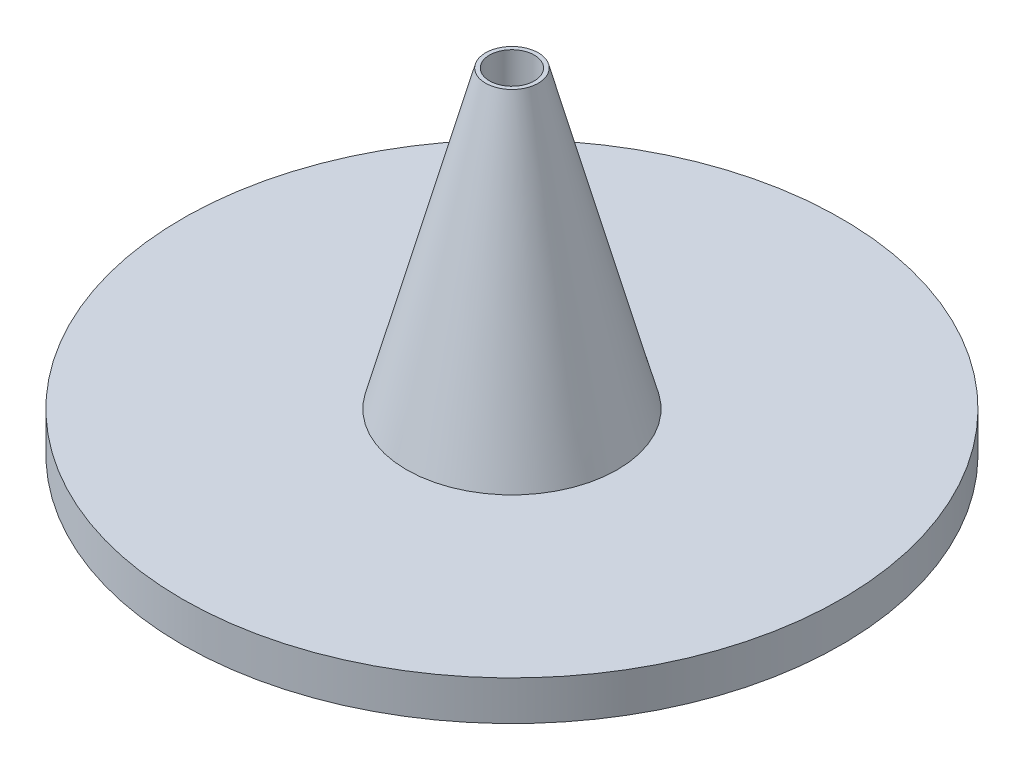
ISO-10303-21;
HEADER;
FILE_DESCRIPTION(('STEP AP214'),'2;1');
FILE_NAME('part.step','',(''),(''),'','','');
FILE_SCHEMA(('AUTOMOTIVE_DESIGN { 1 0 10303 214 1 1 1 1 }'));
ENDSEC;
DATA;
#1=APPLICATION_CONTEXT('core data for automotive mechanical design processes');
#2=APPLICATION_PROTOCOL_DEFINITION('international standard','automotive_design',2000,#1);
#3=PRODUCT_CONTEXT('',#1,'mechanical');
#4=PRODUCT('Part','Part','',(#3));
#5=PRODUCT_RELATED_PRODUCT_CATEGORY('part','',(#4));
#6=PRODUCT_DEFINITION_FORMATION('','',#4);
#7=PRODUCT_DEFINITION_CONTEXT('part definition',#1,'design');
#8=PRODUCT_DEFINITION('design','',#6,#7);
#9=PRODUCT_DEFINITION_SHAPE('','',#8);
#10=(LENGTH_UNIT() NAMED_UNIT(*) SI_UNIT(.MILLI.,.METRE.));
#11=(NAMED_UNIT(*) PLANE_ANGLE_UNIT() SI_UNIT($,.RADIAN.));
#12=(NAMED_UNIT(*) SI_UNIT($,.STERADIAN.) SOLID_ANGLE_UNIT());
#13=UNCERTAINTY_MEASURE_WITH_UNIT(LENGTH_MEASURE(1.E-05),#10,'distance_accuracy_value','');
#14=(GEOMETRIC_REPRESENTATION_CONTEXT(3) GLOBAL_UNCERTAINTY_ASSIGNED_CONTEXT((#13)) GLOBAL_UNIT_ASSIGNED_CONTEXT((#10,
#11,#12)) REPRESENTATION_CONTEXT('',''));
#15=CARTESIAN_POINT('',(0.,0.,0.));
#16=DIRECTION('',(0.,0.,1.));
#17=DIRECTION('',(1.,0.,0.));
#18=AXIS2_PLACEMENT_3D('',#15,#16,#17);
#19=CARTESIAN_POINT('',(0.,3.,0.));
#20=DIRECTION('',(0.,-1.,0.));
#21=DIRECTION('',(0.,0.,-1.));
#22=AXIS2_PLACEMENT_3D('',#19,#20,#21);
#23=CYLINDRICAL_SURFACE('',#22,25.);
#24=CARTESIAN_POINT('',(0.,3.,0.));
#25=DIRECTION('',(0.,1.,0.));
#26=DIRECTION('',(0.,0.,1.));
#27=AXIS2_PLACEMENT_3D('',#24,#25,#26);
#28=CIRCLE('',#27,25.);
#29=CARTESIAN_POINT('',(0.,3.,25.));
#30=VERTEX_POINT('',#29);
#31=EDGE_CURVE('E10',#30,#30,#28,.T.);
#32=ORIENTED_EDGE('',*,*,#31,.F.);
#33=EDGE_LOOP('',(#32));
#34=FACE_BOUND('',#33,.T.);
#35=CARTESIAN_POINT('',(0.,0.,0.));
#36=DIRECTION('',(0.,1.,0.));
#37=DIRECTION('',(0.,0.,1.));
#38=AXIS2_PLACEMENT_3D('',#35,#36,#37);
#39=CIRCLE('',#38,25.);
#40=CARTESIAN_POINT('',(0.,0.,25.));
#41=VERTEX_POINT('',#40);
#42=EDGE_CURVE('E40',#41,#41,#39,.T.);
#43=ORIENTED_EDGE('',*,*,#42,.T.);
#44=EDGE_LOOP('',(#43));
#45=FACE_BOUND('',#44,.T.);
#46=ADVANCED_FACE('F37',(#34,#45),#23,.T.);
#47=CARTESIAN_POINT('',(0.,3.,0.));
#48=DIRECTION('',(0.,1.,0.));
#49=DIRECTION('',(0.,0.,1.));
#50=AXIS2_PLACEMENT_3D('',#47,#48,#49);
#51=PLANE('',#50);
#52=CARTESIAN_POINT('',(0.,3.,0.));
#53=DIRECTION('',(0.,-1.,0.));
#54=DIRECTION('',(0.,0.,-1.));
#55=AXIS2_PLACEMENT_3D('',#52,#53,#54);
#56=CIRCLE('',#55,8.);
#57=CARTESIAN_POINT('',(0.,3.,-8.));
#58=VERTEX_POINT('',#57);
#59=EDGE_CURVE('E54',#58,#58,#56,.T.);
#60=ORIENTED_EDGE('',*,*,#59,.T.);
#61=EDGE_LOOP('',(#60));
#62=FACE_BOUND('',#61,.T.);
#63=ORIENTED_EDGE('',*,*,#31,.T.);
#64=EDGE_LOOP('',(#63));
#65=FACE_BOUND('',#64,.T.);
#66=ADVANCED_FACE('F90',(#62,#65),#51,.T.);
#67=CARTESIAN_POINT('',(0.,0.,0.));
#68=DIRECTION('',(0.,1.,0.));
#69=DIRECTION('',(0.,0.,1.));
#70=AXIS2_PLACEMENT_3D('',#67,#68,#69);
#71=PLANE('',#70);
#72=CARTESIAN_POINT('',(0.,0.,0.));
#73=DIRECTION('',(0.,1.,0.));
#74=DIRECTION('',(0.,0.,1.));
#75=AXIS2_PLACEMENT_3D('',#72,#73,#74);
#76=CIRCLE('',#75,1.7);
#77=CARTESIAN_POINT('',(0.,0.,1.7));
#78=VERTEX_POINT('',#77);
#79=EDGE_CURVE('E58',#78,#78,#76,.T.);
#80=ORIENTED_EDGE('',*,*,#79,.T.);
#81=EDGE_LOOP('',(#80));
#82=FACE_BOUND('',#81,.T.);
#83=ORIENTED_EDGE('',*,*,#42,.F.);
#84=EDGE_LOOP('',(#83));
#85=FACE_BOUND('',#84,.T.);
#86=ADVANCED_FACE('F67',(#82,#85),#71,.F.);
#87=CARTESIAN_POINT('',(0.,25.3923048454132,0.));
#88=DIRECTION('',(0.,-1.,0.));
#89=DIRECTION('',(0.,0.,-1.));
#90=AXIS2_PLACEMENT_3D('',#87,#88,#89);
#91=PLANE('',#90);
#92=CARTESIAN_POINT('',(0.,25.3923048454132,0.));
#93=DIRECTION('',(0.,1.,0.));
#94=DIRECTION('',(0.,0.,1.));
#95=AXIS2_PLACEMENT_3D('',#92,#93,#94);
#96=CIRCLE('',#95,1.7);
#97=CARTESIAN_POINT('',(0.,25.3923048454132,1.7));
#98=VERTEX_POINT('',#97);
#99=EDGE_CURVE('E59',#98,#98,#96,.T.);
#100=ORIENTED_EDGE('',*,*,#99,.F.);
#101=EDGE_LOOP('',(#100));
#102=FACE_BOUND('',#101,.T.);
#103=CARTESIAN_POINT('',(0.,25.3923048454132,0.));
#104=DIRECTION('',(0.,-1.,0.));
#105=DIRECTION('',(0.,0.,-1.));
#106=AXIS2_PLACEMENT_3D('',#103,#104,#105);
#107=CIRCLE('',#106,2.);
#108=CARTESIAN_POINT('',(0.,25.3923048454132,-2.));
#109=VERTEX_POINT('',#108);
#110=EDGE_CURVE('E49',#109,#109,#107,.T.);
#111=ORIENTED_EDGE('',*,*,#110,.F.);
#112=EDGE_LOOP('',(#111));
#113=FACE_BOUND('',#112,.T.);
#114=ADVANCED_FACE('F77',(#102,#113),#91,.F.);
#115=CARTESIAN_POINT('',(0.,25.3923048454132,0.));
#116=DIRECTION('',(0.,-1.,0.));
#117=DIRECTION('',(0.,0.,-1.));
#118=AXIS2_PLACEMENT_3D('',#115,#116,#117);
#119=CONICAL_SURFACE('',#118,2.,0.26179938779915);
#120=CARTESIAN_POINT('',(0.,3.,-8.));
#121=CARTESIAN_POINT('',(0.,3.23325317547305,-7.9375));
#122=CARTESIAN_POINT('',(0.,3.4665063509461,-7.875));
#123=CARTESIAN_POINT('',(0.,3.93301270189221,-7.75));
#124=CARTESIAN_POINT('',(0.,4.16626587736527,-7.6875));
#125=CARTESIAN_POINT('',(0.,4.63277222831138,-7.5625));
#126=CARTESIAN_POINT('',(0.,4.86602540378443,-7.5));
#127=CARTESIAN_POINT('',(0.,5.33253175473054,-7.375));
#128=CARTESIAN_POINT('',(0.,5.56578493020359,-7.3125));
#129=CARTESIAN_POINT('',(0.,6.0322912811497,-7.1875));
#130=CARTESIAN_POINT('',(0.,6.26554445662276,-7.125));
#131=CARTESIAN_POINT('',(0.,6.73205080756887,-7.));
#132=CARTESIAN_POINT('',(0.,6.96530398304192,-6.9375));
#133=CARTESIAN_POINT('',(0.,7.43181033398803,-6.8125));
#134=CARTESIAN_POINT('',(0.,7.66506350946108,-6.75));
#135=CARTESIAN_POINT('',(0.,8.13156986040719,-6.625));
#136=CARTESIAN_POINT('',(0.,8.36482303588025,-6.5625));
#137=CARTESIAN_POINT('',(0.,8.83132938682635,-6.4375));
#138=CARTESIAN_POINT('',(0.,9.06458256229941,-6.375));
#139=CARTESIAN_POINT('',(0.,9.53108891324552,-6.25));
#140=CARTESIAN_POINT('',(0.,9.76434208871857,-6.1875));
#141=CARTESIAN_POINT('',(0.,10.2308484396647,-6.0625));
#142=CARTESIAN_POINT('',(0.,10.4641016151377,-6.));
#143=CARTESIAN_POINT('',(0.,10.9306079660838,-5.875));
#144=CARTESIAN_POINT('',(0.,11.1638611415569,-5.8125));
#145=CARTESIAN_POINT('',(0.,11.630367492503,-5.6875));
#146=CARTESIAN_POINT('',(0.,11.8636206679761,-5.625));
#147=CARTESIAN_POINT('',(0.,12.3301270189222,-5.5));
#148=CARTESIAN_POINT('',(0.,12.5633801943952,-5.4375));
#149=CARTESIAN_POINT('',(0.,13.0298865453413,-5.3125));
#150=CARTESIAN_POINT('',(0.,13.2631397208144,-5.25));
#151=CARTESIAN_POINT('',(0.,13.7296460717605,-5.125));
#152=CARTESIAN_POINT('',(0.,13.9628992472336,-5.0625));
#153=CARTESIAN_POINT('',(0.,14.4294055981797,-4.9375));
#154=CARTESIAN_POINT('',(0.,14.6626587736527,-4.875));
#155=CARTESIAN_POINT('',(0.,15.1291651245988,-4.75));
#156=CARTESIAN_POINT('',(0.,15.3624183000719,-4.6875));
#157=CARTESIAN_POINT('',(0.,15.828924651018,-4.5625));
#158=CARTESIAN_POINT('',(0.,16.062177826491,-4.5));
#159=CARTESIAN_POINT('',(0.,16.5286841774371,-4.375));
#160=CARTESIAN_POINT('',(0.,16.7619373529102,-4.3125));
#161=CARTESIAN_POINT('',(0.,17.2284437038563,-4.1875));
#162=CARTESIAN_POINT('',(0.,17.4616968793294,-4.125));
#163=CARTESIAN_POINT('',(0.,17.9282032302755,-4.));
#164=CARTESIAN_POINT('',(0.,18.1614564057485,-3.9375));
#165=CARTESIAN_POINT('',(0.,18.6279627566946,-3.8125));
#166=CARTESIAN_POINT('',(0.,18.8612159321677,-3.75));
#167=CARTESIAN_POINT('',(0.,19.3277222831138,-3.625));
#168=CARTESIAN_POINT('',(0.,19.5609754585869,-3.5625));
#169=CARTESIAN_POINT('',(0.,20.027481809533,-3.4375));
#170=CARTESIAN_POINT('',(0.,20.260734985006,-3.375));
#171=CARTESIAN_POINT('',(0.,20.7272413359521,-3.25));
#172=CARTESIAN_POINT('',(0.,20.9604945114252,-3.1875));
#173=CARTESIAN_POINT('',(0.,21.4270008623713,-3.0625));
#174=CARTESIAN_POINT('',(0.,21.6602540378443,-3.));
#175=CARTESIAN_POINT('',(0.,22.1267603887905,-2.875));
#176=CARTESIAN_POINT('',(0.,22.3600135642635,-2.8125));
#177=CARTESIAN_POINT('',(0.,22.8265199152096,-2.6875));
#178=CARTESIAN_POINT('',(0.,23.0597730906827,-2.625));
#179=CARTESIAN_POINT('',(0.,23.5262794416288,-2.5));
#180=CARTESIAN_POINT('',(0.,23.7595326171018,-2.4375));
#181=CARTESIAN_POINT('',(0.,24.2260389680479,-2.3125));
#182=CARTESIAN_POINT('',(0.,24.459292143521,-2.25));
#183=CARTESIAN_POINT('',(0.,24.9257984944671,-2.125));
#184=CARTESIAN_POINT('',(0.,25.1590516699402,-2.0625));
#185=CARTESIAN_POINT('',(0.,25.3923048454132,-2.));
#186=B_SPLINE_CURVE_WITH_KNOTS('',3,(#120,#121,#122,#123,#124,#125,#126,#127,#128,#129,#130,
#131,#132,#133,#134,#135,#136,#137,#138,#139,#140,#141,#142,#143,#144,#145,#146,#147,#148,#149,
#150,#151,#152,#153,#154,#155,#156,#157,#158,#159,#160,#161,#162,#163,#164,#165,#166,#167,#168,
#169,#170,#171,#172,#173,#174,#175,#176,#177,#178,#179,#180,#181,#182,#183,#184,#185),
.UNSPECIFIED.,.F.,.F.,(4,2,2,2,2,2,2,2,2,2,2,2,2,2,2,2,2,2,2,2,2,2,2,2,2,2,2,2,2,2,2,2,4),(0.,
0.7244443697168,1.4488887394336,2.1733331091504,2.8977774788672,3.622221848584,4.3466662183008,
5.0711105880176,5.7955549577344,6.5199993274512,7.244443697168,7.9688880668848,8.6933324366016,
9.4177768063184,10.1422211760352,10.866665545752,11.5911099154688,12.3155542851856,
13.0399986549024,13.7644430246192,14.488887394336,15.2133317640528,15.9377761337696,
16.6622205034864,17.3866648732032,18.11110924292,18.8355536126368,19.5599979823536,
20.2844423520704,21.0088867217872,21.733331091504,22.4577754612208,23.1822198309376),.UNSPECIFIED.);
#187=EDGE_CURVE('BSEAM73',#58,#109,#186,.T.);
#188=ORIENTED_EDGE('',*,*,#59,.F.);
#189=ORIENTED_EDGE('',*,*,#110,.T.);
#190=ORIENTED_EDGE('',*,*,#187,.T.);
#191=ORIENTED_EDGE('',*,*,#187,.F.);
#192=EDGE_LOOP('',(#188,#190,#189,#191));
#193=FACE_BOUND('',#192,.T.);
#194=ADVANCED_FACE('F73',(#193),#119,.T.);
#195=CARTESIAN_POINT('',(0.,0.,0.));
#196=DIRECTION('',(0.,1.,0.));
#197=DIRECTION('',(0.,0.,1.));
#198=AXIS2_PLACEMENT_3D('',#195,#196,#197);
#199=CYLINDRICAL_SURFACE('',#198,1.7);
#200=CARTESIAN_POINT('',(0.,0.,1.7));
#201=CARTESIAN_POINT('',(0.,0.264503175473054,1.7));
#202=CARTESIAN_POINT('',(0.,0.529006350946108,1.7));
#203=CARTESIAN_POINT('',(0.,1.05801270189222,1.7));
#204=CARTESIAN_POINT('',(0.,1.32251587736527,1.7));
#205=CARTESIAN_POINT('',(0.,1.85152222831138,1.7));
#206=CARTESIAN_POINT('',(0.,2.11602540378443,1.7));
#207=CARTESIAN_POINT('',(0.,2.64503175473054,1.7));
#208=CARTESIAN_POINT('',(0.,2.9095349302036,1.7));
#209=CARTESIAN_POINT('',(0.,3.4385412811497,1.7));
#210=CARTESIAN_POINT('',(0.,3.70304445662276,1.7));
#211=CARTESIAN_POINT('',(0.,4.23205080756887,1.7));
#212=CARTESIAN_POINT('',(0.,4.49655398304192,1.7));
#213=CARTESIAN_POINT('',(0.,5.02556033398803,1.7));
#214=CARTESIAN_POINT('',(0.,5.29006350946108,1.7));
#215=CARTESIAN_POINT('',(0.,5.81906986040719,1.7));
#216=CARTESIAN_POINT('',(0.,6.08357303588025,1.7));
#217=CARTESIAN_POINT('',(0.,6.61257938682636,1.7));
#218=CARTESIAN_POINT('',(0.,6.87708256229941,1.7));
#219=CARTESIAN_POINT('',(0.,7.40608891324552,1.7));
#220=CARTESIAN_POINT('',(0.,7.67059208871857,1.7));
#221=CARTESIAN_POINT('',(0.,8.19959843966468,1.7));
#222=CARTESIAN_POINT('',(0.,8.46410161513774,1.7));
#223=CARTESIAN_POINT('',(0.,8.99310796608384,1.7));
#224=CARTESIAN_POINT('',(0.,9.2576111415569,1.7));
#225=CARTESIAN_POINT('',(0.,9.78661749250301,1.7));
#226=CARTESIAN_POINT('',(0.,10.0511206679761,1.7));
#227=CARTESIAN_POINT('',(0.,10.5801270189222,1.7));
#228=CARTESIAN_POINT('',(0.,10.8446301943952,1.7));
#229=CARTESIAN_POINT('',(0.,11.3736365453413,1.7));
#230=CARTESIAN_POINT('',(0.,11.6381397208144,1.7));
#231=CARTESIAN_POINT('',(0.,12.1671460717605,1.7));
#232=CARTESIAN_POINT('',(0.,12.4316492472335,1.7));
#233=CARTESIAN_POINT('',(0.,12.9606555981797,1.7));
#234=CARTESIAN_POINT('',(0.,13.2251587736527,1.7));
#235=CARTESIAN_POINT('',(0.,13.7541651245988,1.7));
#236=CARTESIAN_POINT('',(0.,14.0186683000719,1.7));
#237=CARTESIAN_POINT('',(0.,14.547674651018,1.7));
#238=CARTESIAN_POINT('',(0.,14.812177826491,1.7));
#239=CARTESIAN_POINT('',(0.,15.3411841774371,1.7));
#240=CARTESIAN_POINT('',(0.,15.6056873529102,1.7));
#241=CARTESIAN_POINT('',(0.,16.1346937038563,1.7));
#242=CARTESIAN_POINT('',(0.,16.3991968793294,1.7));
#243=CARTESIAN_POINT('',(0.,16.9282032302755,1.7));
#244=CARTESIAN_POINT('',(0.,17.1927064057485,1.7));
#245=CARTESIAN_POINT('',(0.,17.7217127566946,1.7));
#246=CARTESIAN_POINT('',(0.,17.9862159321677,1.7));
#247=CARTESIAN_POINT('',(0.,18.5152222831138,1.7));
#248=CARTESIAN_POINT('',(0.,18.7797254585868,1.7));
#249=CARTESIAN_POINT('',(0.,19.308731809533,1.7));
#250=CARTESIAN_POINT('',(0.,19.573234985006,1.7));
#251=CARTESIAN_POINT('',(0.,20.1022413359521,1.7));
#252=CARTESIAN_POINT('',(0.,20.3667445114252,1.7));
#253=CARTESIAN_POINT('',(0.,20.8957508623713,1.7));
#254=CARTESIAN_POINT('',(0.,21.1602540378443,1.7));
#255=CARTESIAN_POINT('',(0.,21.6892603887904,1.7));
#256=CARTESIAN_POINT('',(0.,21.9537635642635,1.7));
#257=CARTESIAN_POINT('',(0.,22.4827699152096,1.7));
#258=CARTESIAN_POINT('',(0.,22.7472730906827,1.7));
#259=CARTESIAN_POINT('',(0.,23.2762794416288,1.7));
#260=CARTESIAN_POINT('',(0.,23.5407826171018,1.7));
#261=CARTESIAN_POINT('',(0.,24.0697889680479,1.7));
#262=CARTESIAN_POINT('',(0.,24.334292143521,1.7));
#263=CARTESIAN_POINT('',(0.,24.8632984944671,1.7));
#264=CARTESIAN_POINT('',(0.,25.1278016699402,1.7));
#265=CARTESIAN_POINT('',(0.,25.3923048454132,1.7));
#266=B_SPLINE_CURVE_WITH_KNOTS('',3,(#200,#201,#202,#203,#204,#205,#206,#207,#208,#209,#210,
#211,#212,#213,#214,#215,#216,#217,#218,#219,#220,#221,#222,#223,#224,#225,#226,#227,#228,#229,
#230,#231,#232,#233,#234,#235,#236,#237,#238,#239,#240,#241,#242,#243,#244,#245,#246,#247,#248,
#249,#250,#251,#252,#253,#254,#255,#256,#257,#258,#259,#260,#261,#262,#263,#264,#265),
.UNSPECIFIED.,.F.,.F.,(4,2,2,2,2,2,2,2,2,2,2,2,2,2,2,2,2,2,2,2,2,2,2,2,2,2,2,2,2,2,2,2,4),(0.,
0.793509526419163,1.58701905283833,2.38052857925749,3.17403810567665,3.96754763209581,
4.76105715851498,5.55456668493414,6.3480762113533,7.14158573777246,7.93509526419163,
8.72860479061079,9.52211431702995,10.3156238434491,11.1091333698683,11.9026428962874,
12.6961524227066,13.4896619491258,14.2831714755449,15.0766810019641,15.8701905283833,
16.6637000548024,17.4572095812216,18.2507191076407,19.0442286340599,19.8377381604791,
20.6312476868982,21.4247572133174,22.2182667397366,23.0117762661557,23.8052857925749,
24.598795318994,25.3923048454132),.UNSPECIFIED.);
#267=EDGE_CURVE('BSEAM70',#78,#98,#266,.T.);
#268=ORIENTED_EDGE('',*,*,#79,.F.);
#269=ORIENTED_EDGE('',*,*,#99,.T.);
#270=ORIENTED_EDGE('',*,*,#267,.T.);
#271=ORIENTED_EDGE('',*,*,#267,.F.);
#272=EDGE_LOOP('',(#268,#270,#269,#271));
#273=FACE_BOUND('',#272,.T.);
#274=ADVANCED_FACE('F70',(#273),#199,.F.);
#275=CLOSED_SHELL('',(#46,#66,#86,#114,#194,#274));
#276=MANIFOLD_SOLID_BREP('B2',#275);
#277=ADVANCED_BREP_SHAPE_REPRESENTATION('',(#18,#276),#14);
#278=SHAPE_DEFINITION_REPRESENTATION(#9,#277);
ENDSEC;
END-ISO-10303-21;
